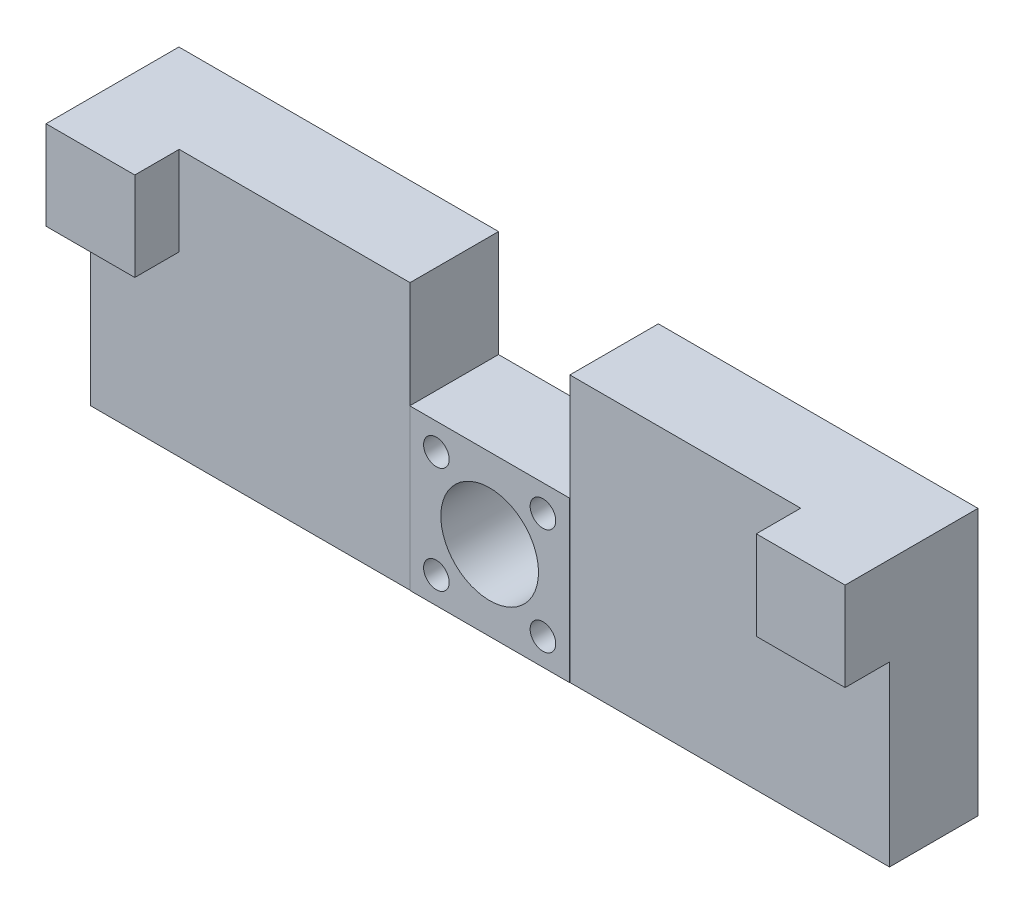
ISO-10303-21;
HEADER;
FILE_DESCRIPTION(('STEP AP214'),'2;1');
FILE_NAME('part.step','',(''),(''),'','','');
FILE_SCHEMA(('AUTOMOTIVE_DESIGN { 1 0 10303 214 1 1 1 1 }'));
ENDSEC;
DATA;
#1=APPLICATION_CONTEXT('core data for automotive mechanical design processes');
#2=APPLICATION_PROTOCOL_DEFINITION('international standard','automotive_design',2000,#1);
#3=PRODUCT_CONTEXT('',#1,'mechanical');
#4=PRODUCT('Part','Part','',(#3));
#5=PRODUCT_RELATED_PRODUCT_CATEGORY('part','',(#4));
#6=PRODUCT_DEFINITION_FORMATION('','',#4);
#7=PRODUCT_DEFINITION_CONTEXT('part definition',#1,'design');
#8=PRODUCT_DEFINITION('design','',#6,#7);
#9=PRODUCT_DEFINITION_SHAPE('','',#8);
#10=(LENGTH_UNIT() NAMED_UNIT(*) SI_UNIT(.MILLI.,.METRE.));
#11=(NAMED_UNIT(*) PLANE_ANGLE_UNIT() SI_UNIT($,.RADIAN.));
#12=(NAMED_UNIT(*) SI_UNIT($,.STERADIAN.) SOLID_ANGLE_UNIT());
#13=UNCERTAINTY_MEASURE_WITH_UNIT(LENGTH_MEASURE(1.E-05),#10,'distance_accuracy_value','');
#14=(GEOMETRIC_REPRESENTATION_CONTEXT(3) GLOBAL_UNCERTAINTY_ASSIGNED_CONTEXT((#13)) GLOBAL_UNIT_ASSIGNED_CONTEXT((#10,
#11,#12)) REPRESENTATION_CONTEXT('',''));
#15=CARTESIAN_POINT('',(0.,0.,0.));
#16=DIRECTION('',(0.,0.,1.));
#17=DIRECTION('',(1.,0.,0.));
#18=AXIS2_PLACEMENT_3D('',#15,#16,#17);
#19=CARTESIAN_POINT('',(-9.,21.,9.96800646844379));
#20=DIRECTION('',(0.,0.,1.));
#21=DIRECTION('',(1.,0.,0.));
#22=AXIS2_PLACEMENT_3D('',#19,#20,#21);
#23=PLANE('',#22);
#24=DIRECTION('',(0.,1.,0.));
#25=VECTOR('',#24,1.);
#26=CARTESIAN_POINT('',(-35.,21.,9.96800646844379));
#27=LINE('',#26,#25);
#28=CARTESIAN_POINT('',(-35.,11.,9.96800646844378));
#29=VERTEX_POINT('',#28);
#30=CARTESIAN_POINT('',(-35.,21.,9.96800646844378));
#31=VERTEX_POINT('',#30);
#32=EDGE_CURVE('E62',#29,#31,#27,.T.);
#33=ORIENTED_EDGE('',*,*,#32,.F.);
#34=DIRECTION('',(1.,0.,0.));
#35=VECTOR('',#34,1.);
#36=CARTESIAN_POINT('',(-45.,11.,9.96800646844379));
#37=LINE('',#36,#35);
#38=CARTESIAN_POINT('',(-45.,11.,9.96800646844378));
#39=VERTEX_POINT('',#38);
#40=EDGE_CURVE('E66',#39,#29,#37,.T.);
#41=ORIENTED_EDGE('',*,*,#40,.F.);
#42=DIRECTION('',(0.,-1.,0.));
#43=VECTOR('',#42,1.);
#44=CARTESIAN_POINT('',(-45.,21.,9.96800646844378));
#45=LINE('',#44,#43);
#46=CARTESIAN_POINT('',(-45.,-9.,9.96800646844378));
#47=VERTEX_POINT('',#46);
#48=EDGE_CURVE('E296',#39,#47,#45,.T.);
#49=ORIENTED_EDGE('',*,*,#48,.T.);
#50=DIRECTION('',(-1.,0.,0.));
#51=VECTOR('',#50,1.);
#52=CARTESIAN_POINT('',(-9.,-9.,9.96800646844379));
#53=LINE('',#52,#51);
#54=CARTESIAN_POINT('',(-9.,-9.,9.96800646844379));
#55=VERTEX_POINT('',#54);
#56=EDGE_CURVE('E259',#55,#47,#53,.T.);
#57=ORIENTED_EDGE('',*,*,#56,.F.);
#58=DIRECTION('',(0.,-1.,0.));
#59=VECTOR('',#58,1.);
#60=CARTESIAN_POINT('',(-9.,21.,9.96800646844379));
#61=LINE('',#60,#59);
#62=CARTESIAN_POINT('',(-9.,9.,9.96800646844379));
#63=VERTEX_POINT('',#62);
#64=EDGE_CURVE('E53',#63,#55,#61,.T.);
#65=ORIENTED_EDGE('',*,*,#64,.F.);
#66=CARTESIAN_POINT('',(-9.,21.,9.96800646844379));
#67=VERTEX_POINT('',#66);
#68=EDGE_CURVE('E281',#67,#63,#61,.T.);
#69=ORIENTED_EDGE('',*,*,#68,.F.);
#70=DIRECTION('',(-1.,0.,0.));
#71=VECTOR('',#70,1.);
#72=CARTESIAN_POINT('',(-9.,21.,9.96800646844379));
#73=LINE('',#72,#71);
#74=EDGE_CURVE('E177',#67,#31,#73,.T.);
#75=ORIENTED_EDGE('',*,*,#74,.T.);
#76=EDGE_LOOP('',(#33,#41,#49,#57,#65,#69,#75));
#77=FACE_BOUND('',#76,.T.);
#78=ADVANCED_FACE('F43',(#77),#23,.T.);
#79=CARTESIAN_POINT('',(9.,21.,9.96800646844379));
#80=DIRECTION('',(0.,0.,1.));
#81=DIRECTION('',(1.,0.,0.));
#82=AXIS2_PLACEMENT_3D('',#79,#80,#81);
#83=PLANE('',#82);
#84=DIRECTION('',(1.,0.,0.));
#85=VECTOR('',#84,1.);
#86=CARTESIAN_POINT('',(45.,11.,9.96800646844379));
#87=LINE('',#86,#85);
#88=CARTESIAN_POINT('',(35.,11.,9.96800646844379));
#89=VERTEX_POINT('',#88);
#90=CARTESIAN_POINT('',(45.,11.,9.96800646844379));
#91=VERTEX_POINT('',#90);
#92=EDGE_CURVE('E208',#89,#91,#87,.T.);
#93=ORIENTED_EDGE('',*,*,#92,.F.);
#94=DIRECTION('',(0.,-1.,0.));
#95=VECTOR('',#94,1.);
#96=CARTESIAN_POINT('',(35.,21.,9.96800646844379));
#97=LINE('',#96,#95);
#98=CARTESIAN_POINT('',(35.,21.,9.96800646844379));
#99=VERTEX_POINT('',#98);
#100=EDGE_CURVE('E218',#99,#89,#97,.T.);
#101=ORIENTED_EDGE('',*,*,#100,.F.);
#102=DIRECTION('',(-1.,0.,0.));
#103=VECTOR('',#102,1.);
#104=CARTESIAN_POINT('',(9.,21.,9.96800646844379));
#105=LINE('',#104,#103);
#106=CARTESIAN_POINT('',(9.,21.,9.96800646844379));
#107=VERTEX_POINT('',#106);
#108=EDGE_CURVE('E240',#99,#107,#105,.T.);
#109=ORIENTED_EDGE('',*,*,#108,.T.);
#110=DIRECTION('',(0.,-1.,0.));
#111=VECTOR('',#110,1.);
#112=CARTESIAN_POINT('',(9.,21.,9.96800646844379));
#113=LINE('',#112,#111);
#114=CARTESIAN_POINT('',(9.,9.,9.96800646844379));
#115=VERTEX_POINT('',#114);
#116=EDGE_CURVE('E55',#107,#115,#113,.T.);
#117=ORIENTED_EDGE('',*,*,#116,.T.);
#118=CARTESIAN_POINT('',(9.,-9.,9.96800646844379));
#119=VERTEX_POINT('',#118);
#120=EDGE_CURVE('E11',#115,#119,#113,.T.);
#121=ORIENTED_EDGE('',*,*,#120,.T.);
#122=DIRECTION('',(-1.,0.,0.));
#123=VECTOR('',#122,1.);
#124=CARTESIAN_POINT('',(9.,-9.,9.96800646844379));
#125=LINE('',#124,#123);
#126=CARTESIAN_POINT('',(45.,-9.,9.96800646844379));
#127=VERTEX_POINT('',#126);
#128=EDGE_CURVE('E250',#127,#119,#125,.T.);
#129=ORIENTED_EDGE('',*,*,#128,.F.);
#130=DIRECTION('',(0.,-1.,0.));
#131=VECTOR('',#130,1.);
#132=CARTESIAN_POINT('',(45.,21.,9.96800646844379));
#133=LINE('',#132,#131);
#134=EDGE_CURVE('E245',#91,#127,#133,.T.);
#135=ORIENTED_EDGE('',*,*,#134,.F.);
#136=EDGE_LOOP('',(#93,#101,#109,#117,#121,#129,#135));
#137=FACE_BOUND('',#136,.T.);
#138=ADVANCED_FACE('F422',(#137),#83,.T.);
#139=CARTESIAN_POINT('',(9.,-9.,10.));
#140=DIRECTION('',(-1.,0.,0.));
#141=DIRECTION('',(0.,0.,1.));
#142=AXIS2_PLACEMENT_3D('',#139,#140,#141);
#143=PLANE('',#142);
#144=ORIENTED_EDGE('',*,*,#120,.F.);
#145=DIRECTION('',(0.,0.,-1.));
#146=VECTOR('',#145,1.);
#147=CARTESIAN_POINT('',(9.,9.,10.));
#148=LINE('',#147,#146);
#149=CARTESIAN_POINT('',(9.,9.,10.));
#150=VERTEX_POINT('',#149);
#151=EDGE_CURVE('E367',#150,#115,#148,.T.);
#152=ORIENTED_EDGE('',*,*,#151,.F.);
#153=DIRECTION('',(0.,1.,0.));
#154=VECTOR('',#153,1.);
#155=CARTESIAN_POINT('',(9.,-9.,10.));
#156=LINE('',#155,#154);
#157=CARTESIAN_POINT('',(9.,-9.,10.));
#158=VERTEX_POINT('',#157);
#159=EDGE_CURVE('E350',#158,#150,#156,.T.);
#160=ORIENTED_EDGE('',*,*,#159,.F.);
#161=DIRECTION('',(0.,0.,-1.));
#162=VECTOR('',#161,1.);
#163=CARTESIAN_POINT('',(9.,-9.,10.));
#164=LINE('',#163,#162);
#165=EDGE_CURVE('E370',#158,#119,#164,.T.);
#166=ORIENTED_EDGE('',*,*,#165,.T.);
#167=EDGE_LOOP('',(#144,#152,#160,#166));
#168=FACE_BOUND('',#167,.T.);
#169=ADVANCED_FACE('F456',(#168),#143,.F.);
#170=CARTESIAN_POINT('',(-9.,-9.,10.));
#171=DIRECTION('',(1.,0.,0.));
#172=DIRECTION('',(0.,0.,-1.));
#173=AXIS2_PLACEMENT_3D('',#170,#171,#172);
#174=PLANE('',#173);
#175=DIRECTION('',(0.,0.,-1.));
#176=VECTOR('',#175,1.);
#177=CARTESIAN_POINT('',(-9.,9.,10.));
#178=LINE('',#177,#176);
#179=CARTESIAN_POINT('',(-9.,9.,10.));
#180=VERTEX_POINT('',#179);
#181=EDGE_CURVE('E362',#180,#63,#178,.T.);
#182=ORIENTED_EDGE('',*,*,#181,.T.);
#183=ORIENTED_EDGE('',*,*,#64,.T.);
#184=DIRECTION('',(0.,0.,-1.));
#185=VECTOR('',#184,1.);
#186=CARTESIAN_POINT('',(-9.,-9.,10.));
#187=LINE('',#186,#185);
#188=CARTESIAN_POINT('',(-9.,-9.,10.));
#189=VERTEX_POINT('',#188);
#190=EDGE_CURVE('E47',#189,#55,#187,.T.);
#191=ORIENTED_EDGE('',*,*,#190,.F.);
#192=DIRECTION('',(0.,-1.,0.));
#193=VECTOR('',#192,1.);
#194=CARTESIAN_POINT('',(-9.,-9.,10.));
#195=LINE('',#194,#193);
#196=EDGE_CURVE('E342',#180,#189,#195,.T.);
#197=ORIENTED_EDGE('',*,*,#196,.F.);
#198=EDGE_LOOP('',(#182,#183,#191,#197));
#199=FACE_BOUND('',#198,.T.);
#200=ADVANCED_FACE('F45',(#199),#174,.F.);
#201=CARTESIAN_POINT('',(9.,-9.,10.));
#202=DIRECTION('',(0.,1.,0.));
#203=DIRECTION('',(0.,0.,1.));
#204=AXIS2_PLACEMENT_3D('',#201,#202,#203);
#205=PLANE('',#204);
#206=DIRECTION('',(1.,0.,0.));
#207=VECTOR('',#206,1.);
#208=CARTESIAN_POINT('',(9.,-9.,0.));
#209=LINE('',#208,#207);
#210=CARTESIAN_POINT('',(-45.,-9.,0.));
#211=VERTEX_POINT('',#210);
#212=CARTESIAN_POINT('',(45.,-9.,0.));
#213=VERTEX_POINT('',#212);
#214=EDGE_CURVE('E338',#211,#213,#209,.T.);
#215=ORIENTED_EDGE('',*,*,#214,.T.);
#216=DIRECTION('',(0.,0.,1.));
#217=VECTOR('',#216,1.);
#218=CARTESIAN_POINT('',(45.,-9.,0.));
#219=LINE('',#218,#217);
#220=EDGE_CURVE('E254',#213,#127,#219,.T.);
#221=ORIENTED_EDGE('',*,*,#220,.T.);
#222=ORIENTED_EDGE('',*,*,#128,.T.);
#223=ORIENTED_EDGE('',*,*,#165,.F.);
#224=DIRECTION('',(1.,0.,0.));
#225=VECTOR('',#224,1.);
#226=CARTESIAN_POINT('',(9.,-9.,10.));
#227=LINE('',#226,#225);
#228=EDGE_CURVE('E346',#189,#158,#227,.T.);
#229=ORIENTED_EDGE('',*,*,#228,.F.);
#230=ORIENTED_EDGE('',*,*,#190,.T.);
#231=ORIENTED_EDGE('',*,*,#56,.T.);
#232=DIRECTION('',(0.,0.,-1.));
#233=VECTOR('',#232,1.);
#234=CARTESIAN_POINT('',(-45.,-9.,0.));
#235=LINE('',#234,#233);
#236=EDGE_CURVE('E276',#47,#211,#235,.T.);
#237=ORIENTED_EDGE('',*,*,#236,.T.);
#238=EDGE_LOOP('',(#215,#221,#222,#223,#229,#230,#231,#237));
#239=FACE_BOUND('',#238,.T.);
#240=ADVANCED_FACE('F412',(#239),#205,.F.);
#241=CARTESIAN_POINT('',(9.,9.,10.));
#242=DIRECTION('',(0.,-1.,0.));
#243=DIRECTION('',(1.,0.,0.));
#244=AXIS2_PLACEMENT_3D('',#241,#242,#243);
#245=PLANE('',#244);
#246=DIRECTION('',(-1.,0.,0.));
#247=VECTOR('',#246,1.);
#248=CARTESIAN_POINT('',(9.,9.,0.));
#249=LINE('',#248,#247);
#250=CARTESIAN_POINT('',(9.,9.,0.));
#251=VERTEX_POINT('',#250);
#252=CARTESIAN_POINT('',(-9.,9.,0.));
#253=VERTEX_POINT('',#252);
#254=EDGE_CURVE('E347',#251,#253,#249,.T.);
#255=ORIENTED_EDGE('',*,*,#254,.T.);
#256=EDGE_CURVE('E356',#63,#253,#178,.T.);
#257=ORIENTED_EDGE('',*,*,#256,.F.);
#258=ORIENTED_EDGE('',*,*,#181,.F.);
#259=DIRECTION('',(-1.,0.,0.));
#260=VECTOR('',#259,1.);
#261=CARTESIAN_POINT('',(9.,9.,10.));
#262=LINE('',#261,#260);
#263=EDGE_CURVE('E353',#150,#180,#262,.T.);
#264=ORIENTED_EDGE('',*,*,#263,.F.);
#265=ORIENTED_EDGE('',*,*,#151,.T.);
#266=EDGE_CURVE('E366',#115,#251,#148,.T.);
#267=ORIENTED_EDGE('',*,*,#266,.T.);
#268=EDGE_LOOP('',(#255,#257,#258,#264,#265,#267));
#269=FACE_BOUND('',#268,.T.);
#270=ADVANCED_FACE('F389',(#269),#245,.F.);
#271=CARTESIAN_POINT('',(0.,0.,10.));
#272=DIRECTION('',(0.,0.,1.));
#273=DIRECTION('',(1.,0.,0.));
#274=AXIS2_PLACEMENT_3D('',#271,#272,#273);
#275=PLANE('',#274);
#276=CARTESIAN_POINT('',(6.,6.,10.));
#277=DIRECTION('',(0.,0.,1.));
#278=DIRECTION('',(1.,0.,0.));
#279=AXIS2_PLACEMENT_3D('',#276,#277,#278);
#280=CIRCLE('',#279,1.4414885030824);
#281=CARTESIAN_POINT('',(7.4414885030824,6.,10.));
#282=VERTEX_POINT('',#281);
#283=EDGE_CURVE('E318',#282,#282,#280,.T.);
#284=ORIENTED_EDGE('',*,*,#283,.F.);
#285=EDGE_LOOP('',(#284));
#286=FACE_BOUND('',#285,.T.);
#287=CARTESIAN_POINT('',(6.,-6.,10.));
#288=DIRECTION('',(0.,0.,1.));
#289=DIRECTION('',(1.,0.,0.));
#290=AXIS2_PLACEMENT_3D('',#287,#288,#289);
#291=CIRCLE('',#290,1.4414885030824);
#292=CARTESIAN_POINT('',(7.4414885030824,-6.,10.));
#293=VERTEX_POINT('',#292);
#294=EDGE_CURVE('E327',#293,#293,#291,.T.);
#295=ORIENTED_EDGE('',*,*,#294,.F.);
#296=EDGE_LOOP('',(#295));
#297=FACE_BOUND('',#296,.T.);
#298=CARTESIAN_POINT('',(0.,0.,10.));
#299=DIRECTION('',(0.,0.,1.));
#300=DIRECTION('',(1.,0.,0.));
#301=AXIS2_PLACEMENT_3D('',#298,#299,#300);
#302=CIRCLE('',#301,5.5);
#303=CARTESIAN_POINT('',(5.5,0.,10.));
#304=VERTEX_POINT('',#303);
#305=EDGE_CURVE('E302',#304,#304,#302,.T.);
#306=ORIENTED_EDGE('',*,*,#305,.F.);
#307=EDGE_LOOP('',(#306));
#308=FACE_BOUND('',#307,.T.);
#309=CARTESIAN_POINT('',(-6.,-6.,10.));
#310=DIRECTION('',(0.,0.,1.));
#311=DIRECTION('',(1.,0.,0.));
#312=AXIS2_PLACEMENT_3D('',#309,#310,#311);
#313=CIRCLE('',#312,1.4414885030824);
#314=CARTESIAN_POINT('',(-4.5585114969176,-6.,10.));
#315=VERTEX_POINT('',#314);
#316=EDGE_CURVE('E310',#315,#315,#313,.T.);
#317=ORIENTED_EDGE('',*,*,#316,.F.);
#318=EDGE_LOOP('',(#317));
#319=FACE_BOUND('',#318,.T.);
#320=CARTESIAN_POINT('',(-6.,6.,10.));
#321=DIRECTION('',(0.,0.,1.));
#322=DIRECTION('',(1.,0.,0.));
#323=AXIS2_PLACEMENT_3D('',#320,#321,#322);
#324=CIRCLE('',#323,1.4414885030824);
#325=CARTESIAN_POINT('',(-4.5585114969176,6.,10.));
#326=VERTEX_POINT('',#325);
#327=EDGE_CURVE('E322',#326,#326,#324,.T.);
#328=ORIENTED_EDGE('',*,*,#327,.F.);
#329=EDGE_LOOP('',(#328));
#330=FACE_BOUND('',#329,.T.);
#331=ORIENTED_EDGE('',*,*,#196,.T.);
#332=ORIENTED_EDGE('',*,*,#228,.T.);
#333=ORIENTED_EDGE('',*,*,#159,.T.);
#334=ORIENTED_EDGE('',*,*,#263,.T.);
#335=EDGE_LOOP('',(#331,#332,#333,#334));
#336=FACE_BOUND('',#335,.T.);
#337=ADVANCED_FACE('F483',(#286,#297,#308,#319,#330,#336),#275,.T.);
#338=CARTESIAN_POINT('',(0.,0.,0.));
#339=DIRECTION('',(0.,0.,1.));
#340=DIRECTION('',(1.,0.,0.));
#341=AXIS2_PLACEMENT_3D('',#338,#339,#340);
#342=PLANE('',#341);
#343=CARTESIAN_POINT('',(6.,6.,0.));
#344=DIRECTION('',(0.,0.,1.));
#345=DIRECTION('',(1.,0.,0.));
#346=AXIS2_PLACEMENT_3D('',#343,#344,#345);
#347=CIRCLE('',#346,1.4414885030824);
#348=CARTESIAN_POINT('',(7.4414885030824,6.,0.));
#349=VERTEX_POINT('',#348);
#350=EDGE_CURVE('E323',#349,#349,#347,.T.);
#351=ORIENTED_EDGE('',*,*,#350,.T.);
#352=EDGE_LOOP('',(#351));
#353=FACE_BOUND('',#352,.T.);
#354=CARTESIAN_POINT('',(6.,-6.,0.));
#355=DIRECTION('',(0.,0.,1.));
#356=DIRECTION('',(1.,0.,0.));
#357=AXIS2_PLACEMENT_3D('',#354,#355,#356);
#358=CIRCLE('',#357,1.4414885030824);
#359=CARTESIAN_POINT('',(7.4414885030824,-6.,0.));
#360=VERTEX_POINT('',#359);
#361=EDGE_CURVE('E314',#360,#360,#358,.T.);
#362=ORIENTED_EDGE('',*,*,#361,.T.);
#363=EDGE_LOOP('',(#362));
#364=FACE_BOUND('',#363,.T.);
#365=CARTESIAN_POINT('',(0.,0.,0.));
#366=DIRECTION('',(0.,0.,1.));
#367=DIRECTION('',(1.,0.,0.));
#368=AXIS2_PLACEMENT_3D('',#365,#366,#367);
#369=CIRCLE('',#368,5.5);
#370=CARTESIAN_POINT('',(5.5,0.,0.));
#371=VERTEX_POINT('',#370);
#372=EDGE_CURVE('E292',#371,#371,#369,.T.);
#373=ORIENTED_EDGE('',*,*,#372,.T.);
#374=EDGE_LOOP('',(#373));
#375=FACE_BOUND('',#374,.T.);
#376=CARTESIAN_POINT('',(-6.,-6.,0.));
#377=DIRECTION('',(0.,0.,1.));
#378=DIRECTION('',(1.,0.,0.));
#379=AXIS2_PLACEMENT_3D('',#376,#377,#378);
#380=CIRCLE('',#379,1.4414885030824);
#381=CARTESIAN_POINT('',(-4.5585114969176,-6.,0.));
#382=VERTEX_POINT('',#381);
#383=EDGE_CURVE('E306',#382,#382,#380,.T.);
#384=ORIENTED_EDGE('',*,*,#383,.T.);
#385=EDGE_LOOP('',(#384));
#386=FACE_BOUND('',#385,.T.);
#387=CARTESIAN_POINT('',(-6.,6.,0.));
#388=DIRECTION('',(0.,0.,1.));
#389=DIRECTION('',(1.,0.,0.));
#390=AXIS2_PLACEMENT_3D('',#387,#388,#389);
#391=CIRCLE('',#390,1.4414885030824);
#392=CARTESIAN_POINT('',(-4.5585114969176,6.,0.));
#393=VERTEX_POINT('',#392);
#394=EDGE_CURVE('E334',#393,#393,#391,.T.);
#395=ORIENTED_EDGE('',*,*,#394,.T.);
#396=EDGE_LOOP('',(#395));
#397=FACE_BOUND('',#396,.T.);
#398=ORIENTED_EDGE('',*,*,#214,.F.);
#399=DIRECTION('',(0.,-1.,0.));
#400=VECTOR('',#399,1.);
#401=CARTESIAN_POINT('',(-45.,21.,0.));
#402=LINE('',#401,#400);
#403=CARTESIAN_POINT('',(-45.,21.,0.));
#404=VERTEX_POINT('',#403);
#405=EDGE_CURVE('E293',#404,#211,#402,.T.);
#406=ORIENTED_EDGE('',*,*,#405,.F.);
#407=DIRECTION('',(1.,0.,0.));
#408=VECTOR('',#407,1.);
#409=CARTESIAN_POINT('',(-9.,21.,0.));
#410=LINE('',#409,#408);
#411=CARTESIAN_POINT('',(-9.,21.,0.));
#412=VERTEX_POINT('',#411);
#413=EDGE_CURVE('E172',#404,#412,#410,.T.);
#414=ORIENTED_EDGE('',*,*,#413,.T.);
#415=DIRECTION('',(0.,-1.,0.));
#416=VECTOR('',#415,1.);
#417=CARTESIAN_POINT('',(-9.,21.,0.));
#418=LINE('',#417,#416);
#419=EDGE_CURVE('E288',#412,#253,#418,.T.);
#420=ORIENTED_EDGE('',*,*,#419,.T.);
#421=ORIENTED_EDGE('',*,*,#254,.F.);
#422=DIRECTION('',(0.,-1.,0.));
#423=VECTOR('',#422,1.);
#424=CARTESIAN_POINT('',(9.,21.,0.));
#425=LINE('',#424,#423);
#426=CARTESIAN_POINT('',(9.,21.,0.));
#427=VERTEX_POINT('',#426);
#428=EDGE_CURVE('E236',#427,#251,#425,.T.);
#429=ORIENTED_EDGE('',*,*,#428,.F.);
#430=DIRECTION('',(1.,0.,0.));
#431=VECTOR('',#430,1.);
#432=CARTESIAN_POINT('',(9.,21.,0.));
#433=LINE('',#432,#431);
#434=CARTESIAN_POINT('',(45.,21.,0.));
#435=VERTEX_POINT('',#434);
#436=EDGE_CURVE('E265',#427,#435,#433,.T.);
#437=ORIENTED_EDGE('',*,*,#436,.T.);
#438=DIRECTION('',(0.,-1.,0.));
#439=VECTOR('',#438,1.);
#440=CARTESIAN_POINT('',(45.,21.,0.));
#441=LINE('',#440,#439);
#442=EDGE_CURVE('E241',#435,#213,#441,.T.);
#443=ORIENTED_EDGE('',*,*,#442,.T.);
#444=EDGE_LOOP('',(#398,#406,#414,#420,#421,#429,#437,#443));
#445=FACE_BOUND('',#444,.T.);
#446=ADVANCED_FACE('F411',(#353,#364,#375,#386,#397,#445),#342,.F.);
#447=CARTESIAN_POINT('',(-6.,6.,0.));
#448=DIRECTION('',(0.,0.,1.));
#449=DIRECTION('',(1.,0.,0.));
#450=AXIS2_PLACEMENT_3D('',#447,#448,#449);
#451=CYLINDRICAL_SURFACE('',#450,1.4414885030824);
#452=ORIENTED_EDGE('',*,*,#394,.F.);
#453=EDGE_LOOP('',(#452));
#454=FACE_BOUND('',#453,.T.);
#455=ORIENTED_EDGE('',*,*,#327,.T.);
#456=EDGE_LOOP('',(#455));
#457=FACE_BOUND('',#456,.T.);
#458=ADVANCED_FACE('F472',(#454,#457),#451,.F.);
#459=CARTESIAN_POINT('',(-6.,-6.,0.));
#460=DIRECTION('',(0.,0.,1.));
#461=DIRECTION('',(1.,0.,0.));
#462=AXIS2_PLACEMENT_3D('',#459,#460,#461);
#463=CYLINDRICAL_SURFACE('',#462,1.4414885030824);
#464=ORIENTED_EDGE('',*,*,#383,.F.);
#465=EDGE_LOOP('',(#464));
#466=FACE_BOUND('',#465,.T.);
#467=ORIENTED_EDGE('',*,*,#316,.T.);
#468=EDGE_LOOP('',(#467));
#469=FACE_BOUND('',#468,.T.);
#470=ADVANCED_FACE('F468',(#466,#469),#463,.F.);
#471=CARTESIAN_POINT('',(0.,0.,0.));
#472=DIRECTION('',(0.,0.,1.));
#473=DIRECTION('',(1.,0.,0.));
#474=AXIS2_PLACEMENT_3D('',#471,#472,#473);
#475=CYLINDRICAL_SURFACE('',#474,5.5);
#476=ORIENTED_EDGE('',*,*,#372,.F.);
#477=EDGE_LOOP('',(#476));
#478=FACE_BOUND('',#477,.T.);
#479=ORIENTED_EDGE('',*,*,#305,.T.);
#480=EDGE_LOOP('',(#479));
#481=FACE_BOUND('',#480,.T.);
#482=ADVANCED_FACE('F464',(#478,#481),#475,.F.);
#483=CARTESIAN_POINT('',(6.,-6.,0.));
#484=DIRECTION('',(0.,0.,1.));
#485=DIRECTION('',(1.,0.,0.));
#486=AXIS2_PLACEMENT_3D('',#483,#484,#485);
#487=CYLINDRICAL_SURFACE('',#486,1.4414885030824);
#488=ORIENTED_EDGE('',*,*,#361,.F.);
#489=EDGE_LOOP('',(#488));
#490=FACE_BOUND('',#489,.T.);
#491=ORIENTED_EDGE('',*,*,#294,.T.);
#492=EDGE_LOOP('',(#491));
#493=FACE_BOUND('',#492,.T.);
#494=ADVANCED_FACE('F467',(#490,#493),#487,.F.);
#495=CARTESIAN_POINT('',(6.,6.,0.));
#496=DIRECTION('',(0.,0.,1.));
#497=DIRECTION('',(1.,0.,0.));
#498=AXIS2_PLACEMENT_3D('',#495,#496,#497);
#499=CYLINDRICAL_SURFACE('',#498,1.4414885030824);
#500=ORIENTED_EDGE('',*,*,#350,.F.);
#501=EDGE_LOOP('',(#500));
#502=FACE_BOUND('',#501,.T.);
#503=ORIENTED_EDGE('',*,*,#283,.T.);
#504=EDGE_LOOP('',(#503));
#505=FACE_BOUND('',#504,.T.);
#506=ADVANCED_FACE('F463',(#502,#505),#499,.F.);
#507=CARTESIAN_POINT('',(-9.,21.,0.));
#508=DIRECTION('',(1.,0.,0.));
#509=DIRECTION('',(0.,0.,-1.));
#510=AXIS2_PLACEMENT_3D('',#507,#508,#509);
#511=PLANE('',#510);
#512=ORIENTED_EDGE('',*,*,#68,.T.);
#513=ORIENTED_EDGE('',*,*,#256,.T.);
#514=ORIENTED_EDGE('',*,*,#419,.F.);
#515=DIRECTION('',(0.,0.,1.));
#516=VECTOR('',#515,1.);
#517=CARTESIAN_POINT('',(-9.,21.,0.));
#518=LINE('',#517,#516);
#519=EDGE_CURVE('E272',#412,#67,#518,.T.);
#520=ORIENTED_EDGE('',*,*,#519,.T.);
#521=EDGE_LOOP('',(#512,#513,#514,#520));
#522=FACE_BOUND('',#521,.T.);
#523=ADVANCED_FACE('F387',(#522),#511,.T.);
#524=CARTESIAN_POINT('',(-45.,21.,0.));
#525=DIRECTION('',(-1.,0.,0.));
#526=DIRECTION('',(0.,0.,1.));
#527=AXIS2_PLACEMENT_3D('',#524,#525,#526);
#528=PLANE('',#527);
#529=ORIENTED_EDGE('',*,*,#236,.F.);
#530=ORIENTED_EDGE('',*,*,#48,.F.);
#531=DIRECTION('',(0.,0.,-1.));
#532=VECTOR('',#531,1.);
#533=CARTESIAN_POINT('',(-45.,11.,14.9680064684438));
#534=LINE('',#533,#532);
#535=CARTESIAN_POINT('',(-45.,11.,14.9680064684438));
#536=VERTEX_POINT('',#535);
#537=EDGE_CURVE('E193',#536,#39,#534,.T.);
#538=ORIENTED_EDGE('',*,*,#537,.F.);
#539=DIRECTION('',(0.,-1.,0.));
#540=VECTOR('',#539,1.);
#541=CARTESIAN_POINT('',(-45.,21.,14.9680064684438));
#542=LINE('',#541,#540);
#543=CARTESIAN_POINT('',(-45.,21.,14.9680064684438));
#544=VERTEX_POINT('',#543);
#545=EDGE_CURVE('E182',#544,#536,#542,.T.);
#546=ORIENTED_EDGE('',*,*,#545,.F.);
#547=DIRECTION('',(0.,0.,-1.));
#548=VECTOR('',#547,1.);
#549=CARTESIAN_POINT('',(-45.,21.,0.));
#550=LINE('',#549,#548);
#551=EDGE_CURVE('E165',#544,#404,#550,.T.);
#552=ORIENTED_EDGE('',*,*,#551,.T.);
#553=ORIENTED_EDGE('',*,*,#405,.T.);
#554=EDGE_LOOP('',(#529,#530,#538,#546,#552,#553));
#555=FACE_BOUND('',#554,.T.);
#556=ADVANCED_FACE('F191',(#555),#528,.T.);
#557=CARTESIAN_POINT('',(0.,21.,0.));
#558=DIRECTION('',(0.,-1.,0.));
#559=DIRECTION('',(0.,0.,-1.));
#560=AXIS2_PLACEMENT_3D('',#557,#558,#559);
#561=PLANE('',#560);
#562=ORIENTED_EDGE('',*,*,#519,.F.);
#563=ORIENTED_EDGE('',*,*,#413,.F.);
#564=ORIENTED_EDGE('',*,*,#551,.F.);
#565=DIRECTION('',(-1.,0.,0.));
#566=VECTOR('',#565,1.);
#567=CARTESIAN_POINT('',(-45.,21.,14.9680064684438));
#568=LINE('',#567,#566);
#569=CARTESIAN_POINT('',(-35.,21.,14.9680064684438));
#570=VERTEX_POINT('',#569);
#571=EDGE_CURVE('E170',#570,#544,#568,.T.);
#572=ORIENTED_EDGE('',*,*,#571,.F.);
#573=DIRECTION('',(0.,0.,-1.));
#574=VECTOR('',#573,1.);
#575=CARTESIAN_POINT('',(-35.,21.,14.9680064684438));
#576=LINE('',#575,#574);
#577=EDGE_CURVE('E188',#570,#31,#576,.T.);
#578=ORIENTED_EDGE('',*,*,#577,.T.);
#579=ORIENTED_EDGE('',*,*,#74,.F.);
#580=EDGE_LOOP('',(#562,#563,#564,#572,#578,#579));
#581=FACE_BOUND('',#580,.T.);
#582=ADVANCED_FACE('F168',(#581),#561,.F.);
#583=CARTESIAN_POINT('',(9.,21.,0.));
#584=DIRECTION('',(-1.,0.,0.));
#585=DIRECTION('',(0.,0.,1.));
#586=AXIS2_PLACEMENT_3D('',#583,#584,#585);
#587=PLANE('',#586);
#588=ORIENTED_EDGE('',*,*,#266,.F.);
#589=ORIENTED_EDGE('',*,*,#116,.F.);
#590=DIRECTION('',(0.,0.,-1.));
#591=VECTOR('',#590,1.);
#592=CARTESIAN_POINT('',(9.,21.,0.));
#593=LINE('',#592,#591);
#594=EDGE_CURVE('E255',#107,#427,#593,.T.);
#595=ORIENTED_EDGE('',*,*,#594,.T.);
#596=ORIENTED_EDGE('',*,*,#428,.T.);
#597=EDGE_LOOP('',(#588,#589,#595,#596));
#598=FACE_BOUND('',#597,.T.);
#599=ADVANCED_FACE('F437',(#598),#587,.T.);
#600=CARTESIAN_POINT('',(45.,21.,0.));
#601=DIRECTION('',(1.,0.,0.));
#602=DIRECTION('',(0.,0.,-1.));
#603=AXIS2_PLACEMENT_3D('',#600,#601,#602);
#604=PLANE('',#603);
#605=ORIENTED_EDGE('',*,*,#220,.F.);
#606=ORIENTED_EDGE('',*,*,#442,.F.);
#607=DIRECTION('',(0.,0.,1.));
#608=VECTOR('',#607,1.);
#609=CARTESIAN_POINT('',(45.,21.,0.));
#610=LINE('',#609,#608);
#611=CARTESIAN_POINT('',(45.,21.,14.9680064684438));
#612=VERTEX_POINT('',#611);
#613=EDGE_CURVE('E262',#435,#612,#610,.T.);
#614=ORIENTED_EDGE('',*,*,#613,.T.);
#615=DIRECTION('',(0.,1.,0.));
#616=VECTOR('',#615,1.);
#617=CARTESIAN_POINT('',(45.,21.,14.9680064684438));
#618=LINE('',#617,#616);
#619=CARTESIAN_POINT('',(45.,11.,14.9680064684438));
#620=VERTEX_POINT('',#619);
#621=EDGE_CURVE('E203',#620,#612,#618,.T.);
#622=ORIENTED_EDGE('',*,*,#621,.F.);
#623=DIRECTION('',(0.,0.,-1.));
#624=VECTOR('',#623,1.);
#625=CARTESIAN_POINT('',(45.,11.,14.9680064684438));
#626=LINE('',#625,#624);
#627=EDGE_CURVE('E217',#620,#91,#626,.T.);
#628=ORIENTED_EDGE('',*,*,#627,.T.);
#629=ORIENTED_EDGE('',*,*,#134,.T.);
#630=EDGE_LOOP('',(#605,#606,#614,#622,#628,#629));
#631=FACE_BOUND('',#630,.T.);
#632=ADVANCED_FACE('F418',(#631),#604,.T.);
#633=CARTESIAN_POINT('',(0.,21.,0.));
#634=DIRECTION('',(0.,1.,0.));
#635=DIRECTION('',(0.,0.,1.));
#636=AXIS2_PLACEMENT_3D('',#633,#634,#635);
#637=PLANE('',#636);
#638=ORIENTED_EDGE('',*,*,#594,.F.);
#639=ORIENTED_EDGE('',*,*,#108,.F.);
#640=DIRECTION('',(0.,0.,-1.));
#641=VECTOR('',#640,1.);
#642=CARTESIAN_POINT('',(35.,21.,14.9680064684438));
#643=LINE('',#642,#641);
#644=CARTESIAN_POINT('',(35.,21.,14.9680064684438));
#645=VERTEX_POINT('',#644);
#646=EDGE_CURVE('E232',#645,#99,#643,.T.);
#647=ORIENTED_EDGE('',*,*,#646,.F.);
#648=DIRECTION('',(-1.,0.,0.));
#649=VECTOR('',#648,1.);
#650=CARTESIAN_POINT('',(45.,21.,14.9680064684438));
#651=LINE('',#650,#649);
#652=EDGE_CURVE('E207',#612,#645,#651,.T.);
#653=ORIENTED_EDGE('',*,*,#652,.F.);
#654=ORIENTED_EDGE('',*,*,#613,.F.);
#655=ORIENTED_EDGE('',*,*,#436,.F.);
#656=EDGE_LOOP('',(#638,#639,#647,#653,#654,#655));
#657=FACE_BOUND('',#656,.T.);
#658=ADVANCED_FACE('F438',(#657),#637,.T.);
#659=CARTESIAN_POINT('',(35.,21.,14.9680064684438));
#660=DIRECTION('',(1.,0.,0.));
#661=DIRECTION('',(0.,0.,-1.));
#662=AXIS2_PLACEMENT_3D('',#659,#660,#661);
#663=PLANE('',#662);
#664=ORIENTED_EDGE('',*,*,#100,.T.);
#665=DIRECTION('',(0.,0.,-1.));
#666=VECTOR('',#665,1.);
#667=CARTESIAN_POINT('',(35.,11.,14.9680064684438));
#668=LINE('',#667,#666);
#669=CARTESIAN_POINT('',(35.,11.,14.9680064684438));
#670=VERTEX_POINT('',#669);
#671=EDGE_CURVE('E228',#670,#89,#668,.T.);
#672=ORIENTED_EDGE('',*,*,#671,.F.);
#673=DIRECTION('',(0.,-1.,0.));
#674=VECTOR('',#673,1.);
#675=CARTESIAN_POINT('',(35.,21.,14.9680064684438));
#676=LINE('',#675,#674);
#677=EDGE_CURVE('E211',#645,#670,#676,.T.);
#678=ORIENTED_EDGE('',*,*,#677,.F.);
#679=ORIENTED_EDGE('',*,*,#646,.T.);
#680=EDGE_LOOP('',(#664,#672,#678,#679));
#681=FACE_BOUND('',#680,.T.);
#682=ADVANCED_FACE('F430',(#681),#663,.F.);
#683=CARTESIAN_POINT('',(45.,11.,14.9680064684438));
#684=DIRECTION('',(0.,1.,0.));
#685=DIRECTION('',(-1.,0.,0.));
#686=AXIS2_PLACEMENT_3D('',#683,#684,#685);
#687=PLANE('',#686);
#688=ORIENTED_EDGE('',*,*,#92,.T.);
#689=ORIENTED_EDGE('',*,*,#627,.F.);
#690=DIRECTION('',(1.,0.,0.));
#691=VECTOR('',#690,1.);
#692=CARTESIAN_POINT('',(45.,11.,14.9680064684438));
#693=LINE('',#692,#691);
#694=EDGE_CURVE('E214',#670,#620,#693,.T.);
#695=ORIENTED_EDGE('',*,*,#694,.F.);
#696=ORIENTED_EDGE('',*,*,#671,.T.);
#697=EDGE_LOOP('',(#688,#689,#695,#696));
#698=FACE_BOUND('',#697,.T.);
#699=ADVANCED_FACE('F425',(#698),#687,.F.);
#700=CARTESIAN_POINT('',(0.,0.,14.9680064684438));
#701=DIRECTION('',(0.,0.,-1.));
#702=DIRECTION('',(-1.,0.,0.));
#703=AXIS2_PLACEMENT_3D('',#700,#701,#702);
#704=PLANE('',#703);
#705=ORIENTED_EDGE('',*,*,#621,.T.);
#706=ORIENTED_EDGE('',*,*,#652,.T.);
#707=ORIENTED_EDGE('',*,*,#677,.T.);
#708=ORIENTED_EDGE('',*,*,#694,.T.);
#709=EDGE_LOOP('',(#705,#706,#707,#708));
#710=FACE_BOUND('',#709,.T.);
#711=ADVANCED_FACE('F441',(#710),#704,.F.);
#712=CARTESIAN_POINT('',(-45.,11.,14.9680064684438));
#713=DIRECTION('',(0.,1.,0.));
#714=DIRECTION('',(0.,0.,1.));
#715=AXIS2_PLACEMENT_3D('',#712,#713,#714);
#716=PLANE('',#715);
#717=ORIENTED_EDGE('',*,*,#40,.T.);
#718=DIRECTION('',(0.,0.,-1.));
#719=VECTOR('',#718,1.);
#720=CARTESIAN_POINT('',(-35.,11.,14.9680064684438));
#721=LINE('',#720,#719);
#722=CARTESIAN_POINT('',(-35.,11.,14.9680064684438));
#723=VERTEX_POINT('',#722);
#724=EDGE_CURVE('E403',#723,#29,#721,.T.);
#725=ORIENTED_EDGE('',*,*,#724,.F.);
#726=DIRECTION('',(1.,0.,0.));
#727=VECTOR('',#726,1.);
#728=CARTESIAN_POINT('',(-45.,11.,14.9680064684438));
#729=LINE('',#728,#727);
#730=EDGE_CURVE('E195',#536,#723,#729,.T.);
#731=ORIENTED_EDGE('',*,*,#730,.F.);
#732=ORIENTED_EDGE('',*,*,#537,.T.);
#733=EDGE_LOOP('',(#717,#725,#731,#732));
#734=FACE_BOUND('',#733,.T.);
#735=ADVANCED_FACE('F407',(#734),#716,.F.);
#736=CARTESIAN_POINT('',(-35.,21.,14.9680064684438));
#737=DIRECTION('',(-1.,0.,0.));
#738=DIRECTION('',(0.,0.,1.));
#739=AXIS2_PLACEMENT_3D('',#736,#737,#738);
#740=PLANE('',#739);
#741=ORIENTED_EDGE('',*,*,#32,.T.);
#742=ORIENTED_EDGE('',*,*,#577,.F.);
#743=DIRECTION('',(0.,1.,0.));
#744=VECTOR('',#743,1.);
#745=CARTESIAN_POINT('',(-35.,21.,14.9680064684438));
#746=LINE('',#745,#744);
#747=EDGE_CURVE('E185',#723,#570,#746,.T.);
#748=ORIENTED_EDGE('',*,*,#747,.F.);
#749=ORIENTED_EDGE('',*,*,#724,.T.);
#750=EDGE_LOOP('',(#741,#742,#748,#749));
#751=FACE_BOUND('',#750,.T.);
#752=ADVANCED_FACE('F409',(#751),#740,.F.);
#753=CARTESIAN_POINT('',(0.,0.,14.9680064684438));
#754=DIRECTION('',(0.,0.,1.));
#755=DIRECTION('',(1.,0.,0.));
#756=AXIS2_PLACEMENT_3D('',#753,#754,#755);
#757=PLANE('',#756);
#758=ORIENTED_EDGE('',*,*,#545,.T.);
#759=ORIENTED_EDGE('',*,*,#730,.T.);
#760=ORIENTED_EDGE('',*,*,#747,.T.);
#761=ORIENTED_EDGE('',*,*,#571,.T.);
#762=EDGE_LOOP('',(#758,#759,#760,#761));
#763=FACE_BOUND('',#762,.T.);
#764=ADVANCED_FACE('F181',(#763),#757,.T.);
#765=CLOSED_SHELL('',(#78,#138,#169,#200,#240,#270,#337,#446,#458,#470,#482,#494,#506,#523,#556,
#582,#599,#632,#658,#682,#699,#711,#735,#752,#764));
#766=MANIFOLD_SOLID_BREP('B2',#765);
#767=ADVANCED_BREP_SHAPE_REPRESENTATION('',(#18,#766),#14);
#768=SHAPE_DEFINITION_REPRESENTATION(#9,#767);
ENDSEC;
END-ISO-10303-21;
